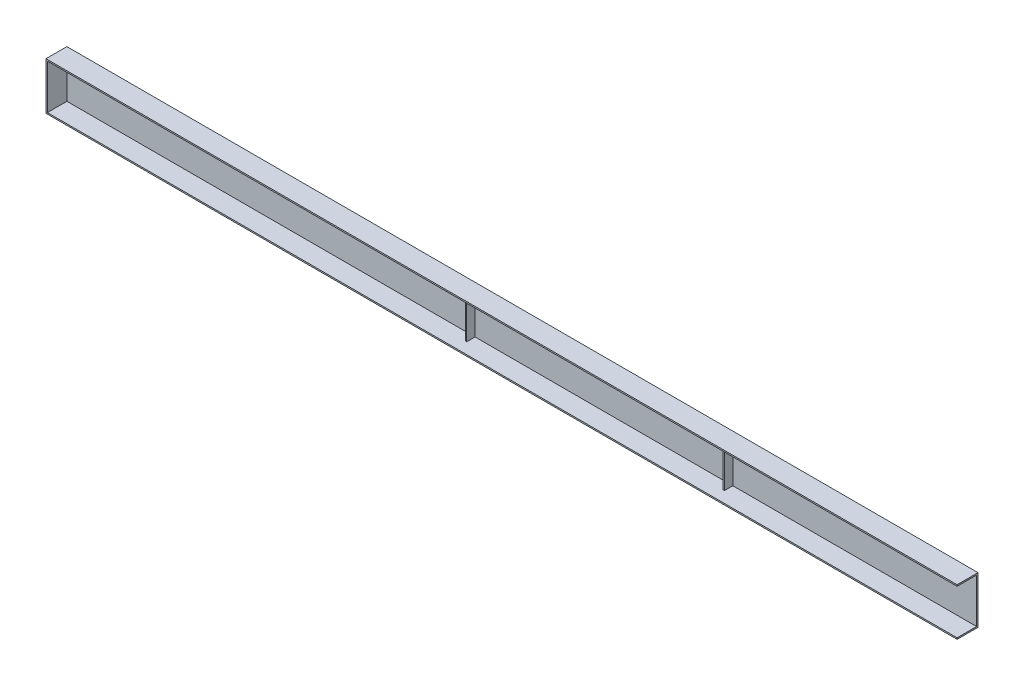
ISO-10303-21;
HEADER;
FILE_DESCRIPTION(('STEP AP214'),'2;1');
FILE_NAME('part.step','',(''),(''),'','','');
FILE_SCHEMA(('AUTOMOTIVE_DESIGN { 1 0 10303 214 1 1 1 1 }'));
ENDSEC;
DATA;
#1=APPLICATION_CONTEXT('core data for automotive mechanical design processes');
#2=APPLICATION_PROTOCOL_DEFINITION('international standard','automotive_design',2000,#1);
#3=PRODUCT_CONTEXT('',#1,'mechanical');
#4=PRODUCT('Part','Part','',(#3));
#5=PRODUCT_RELATED_PRODUCT_CATEGORY('part','',(#4));
#6=PRODUCT_DEFINITION_FORMATION('','',#4);
#7=PRODUCT_DEFINITION_CONTEXT('part definition',#1,'design');
#8=PRODUCT_DEFINITION('design','',#6,#7);
#9=PRODUCT_DEFINITION_SHAPE('','',#8);
#10=(LENGTH_UNIT() NAMED_UNIT(*) SI_UNIT(.MILLI.,.METRE.));
#11=(NAMED_UNIT(*) PLANE_ANGLE_UNIT() SI_UNIT($,.RADIAN.));
#12=(NAMED_UNIT(*) SI_UNIT($,.STERADIAN.) SOLID_ANGLE_UNIT());
#13=UNCERTAINTY_MEASURE_WITH_UNIT(LENGTH_MEASURE(1.E-05),#10,'distance_accuracy_value','');
#14=(GEOMETRIC_REPRESENTATION_CONTEXT(3) GLOBAL_UNCERTAINTY_ASSIGNED_CONTEXT((#13)) GLOBAL_UNIT_ASSIGNED_CONTEXT((#10,
#11,#12)) REPRESENTATION_CONTEXT('',''));
#15=CARTESIAN_POINT('',(0.,0.,0.));
#16=DIRECTION('',(0.,0.,1.));
#17=DIRECTION('',(1.,0.,0.));
#18=AXIS2_PLACEMENT_3D('',#15,#16,#17);
#19=CARTESIAN_POINT('',(-621.,-915.,2038.));
#20=DIRECTION('',(1.,0.,0.));
#21=DIRECTION('',(0.,1.,0.));
#22=AXIS2_PLACEMENT_3D('',#19,#20,#21);
#23=PLANE('',#22);
#24=DIRECTION('',(0.,0.,1.));
#25=VECTOR('',#24,1.);
#26=CARTESIAN_POINT('',(-621.,-847.,2038.));
#27=LINE('',#26,#25);
#28=CARTESIAN_POINT('',(-621.,-847.,2038.));
#29=VERTEX_POINT('',#28);
#30=CARTESIAN_POINT('',(-621.,-847.,2068.));
#31=VERTEX_POINT('',#30);
#32=EDGE_CURVE('E35',#29,#31,#27,.T.);
#33=ORIENTED_EDGE('',*,*,#32,.F.);
#34=DIRECTION('',(0.,1.,0.));
#35=VECTOR('',#34,1.);
#36=CARTESIAN_POINT('',(-621.,-915.,2038.));
#37=LINE('',#36,#35);
#38=CARTESIAN_POINT('',(-621.,-915.,2038.));
#39=VERTEX_POINT('',#38);
#40=EDGE_CURVE('E209',#39,#29,#37,.T.);
#41=ORIENTED_EDGE('',*,*,#40,.F.);
#42=DIRECTION('',(0.,0.,-1.));
#43=VECTOR('',#42,1.);
#44=CARTESIAN_POINT('',(-621.,-915.,2068.));
#45=LINE('',#44,#43);
#46=CARTESIAN_POINT('',(-621.,-915.,2068.));
#47=VERTEX_POINT('',#46);
#48=EDGE_CURVE('E156',#47,#39,#45,.T.);
#49=ORIENTED_EDGE('',*,*,#48,.F.);
#50=DIRECTION('',(0.,1.,0.));
#51=VECTOR('',#50,1.);
#52=CARTESIAN_POINT('',(-621.,-915.,2068.));
#53=LINE('',#52,#51);
#54=EDGE_CURVE('E11',#47,#31,#53,.T.);
#55=ORIENTED_EDGE('',*,*,#54,.T.);
#56=EDGE_LOOP('',(#33,#41,#49,#55));
#57=FACE_BOUND('',#56,.T.);
#58=ADVANCED_FACE('F17',(#57),#23,.F.);
#59=CARTESIAN_POINT('',(-621.,-847.,2068.));
#60=DIRECTION('',(0.,0.,1.));
#61=DIRECTION('',(0.,1.,0.));
#62=AXIS2_PLACEMENT_3D('',#59,#60,#61);
#63=PLANE('',#62);
#64=DIRECTION('',(1.,0.,0.));
#65=VECTOR('',#64,1.);
#66=CARTESIAN_POINT('',(-619.,-849.,2068.));
#67=LINE('',#66,#65);
#68=CARTESIAN_POINT('',(-619.,-849.,2068.));
#69=VERTEX_POINT('',#68);
#70=CARTESIAN_POINT('',(687.,-849.,2068.));
#71=VERTEX_POINT('',#70);
#72=EDGE_CURVE('E27',#69,#71,#67,.T.);
#73=ORIENTED_EDGE('',*,*,#72,.T.);
#74=DIRECTION('',(0.,-1.,0.));
#75=VECTOR('',#74,1.);
#76=CARTESIAN_POINT('',(687.,-847.,2068.));
#77=LINE('',#76,#75);
#78=CARTESIAN_POINT('',(687.,-847.,2068.));
#79=VERTEX_POINT('',#78);
#80=EDGE_CURVE('E106',#79,#71,#77,.T.);
#81=ORIENTED_EDGE('',*,*,#80,.F.);
#82=DIRECTION('',(1.,0.,0.));
#83=VECTOR('',#82,1.);
#84=CARTESIAN_POINT('',(-621.,-847.,2068.));
#85=LINE('',#84,#83);
#86=EDGE_CURVE('E223',#31,#79,#85,.T.);
#87=ORIENTED_EDGE('',*,*,#86,.F.);
#88=ORIENTED_EDGE('',*,*,#54,.F.);
#89=DIRECTION('',(1.,0.,0.));
#90=VECTOR('',#89,1.);
#91=CARTESIAN_POINT('',(-621.,-915.,2068.));
#92=LINE('',#91,#90);
#93=CARTESIAN_POINT('',(687.,-915.,2068.));
#94=VERTEX_POINT('',#93);
#95=EDGE_CURVE('E145',#47,#94,#92,.T.);
#96=ORIENTED_EDGE('',*,*,#95,.T.);
#97=DIRECTION('',(0.,-1.,0.));
#98=VECTOR('',#97,1.);
#99=CARTESIAN_POINT('',(687.,-913.,2068.));
#100=LINE('',#99,#98);
#101=CARTESIAN_POINT('',(687.,-913.,2068.));
#102=VERTEX_POINT('',#101);
#103=EDGE_CURVE('E131',#102,#94,#100,.T.);
#104=ORIENTED_EDGE('',*,*,#103,.F.);
#105=DIRECTION('',(1.,0.,0.));
#106=VECTOR('',#105,1.);
#107=CARTESIAN_POINT('',(-619.,-913.,2068.));
#108=LINE('',#107,#106);
#109=CARTESIAN_POINT('',(-619.,-913.,2068.));
#110=VERTEX_POINT('',#109);
#111=EDGE_CURVE('E200',#110,#102,#108,.T.);
#112=ORIENTED_EDGE('',*,*,#111,.F.);
#113=DIRECTION('',(0.,1.,0.));
#114=VECTOR('',#113,1.);
#115=CARTESIAN_POINT('',(-619.,-913.,2068.));
#116=LINE('',#115,#114);
#117=EDGE_CURVE('E21',#110,#69,#116,.T.);
#118=ORIENTED_EDGE('',*,*,#117,.T.);
#119=EDGE_LOOP('',(#73,#81,#87,#88,#96,#104,#112,#118));
#120=FACE_BOUND('',#119,.T.);
#121=ADVANCED_FACE('F146',(#120),#63,.T.);
#122=CARTESIAN_POINT('',(-619.,-915.,2038.));
#123=DIRECTION('',(-1.,0.,0.));
#124=DIRECTION('',(0.,0.,-1.));
#125=AXIS2_PLACEMENT_3D('',#122,#123,#124);
#126=PLANE('',#125);
#127=DIRECTION('',(0.,0.,-1.));
#128=VECTOR('',#127,1.);
#129=CARTESIAN_POINT('',(-619.,-849.,2068.));
#130=LINE('',#129,#128);
#131=CARTESIAN_POINT('',(-619.,-849.,2040.));
#132=VERTEX_POINT('',#131);
#133=EDGE_CURVE('E171',#69,#132,#130,.T.);
#134=ORIENTED_EDGE('',*,*,#133,.F.);
#135=ORIENTED_EDGE('',*,*,#117,.F.);
#136=DIRECTION('',(0.,0.,1.));
#137=VECTOR('',#136,1.);
#138=CARTESIAN_POINT('',(-619.,-913.,2040.));
#139=LINE('',#138,#137);
#140=CARTESIAN_POINT('',(-619.,-913.,2040.));
#141=VERTEX_POINT('',#140);
#142=EDGE_CURVE('E221',#141,#110,#139,.T.);
#143=ORIENTED_EDGE('',*,*,#142,.F.);
#144=DIRECTION('',(0.,-1.,0.));
#145=VECTOR('',#144,1.);
#146=CARTESIAN_POINT('',(-619.,-849.,2040.));
#147=LINE('',#146,#145);
#148=EDGE_CURVE('E190',#132,#141,#147,.T.);
#149=ORIENTED_EDGE('',*,*,#148,.F.);
#150=EDGE_LOOP('',(#134,#135,#143,#149));
#151=FACE_BOUND('',#150,.T.);
#152=ADVANCED_FACE('F301',(#151),#126,.F.);
#153=CARTESIAN_POINT('',(-621.,-849.,2040.));
#154=DIRECTION('',(0.,0.,1.));
#155=DIRECTION('',(0.,1.,0.));
#156=AXIS2_PLACEMENT_3D('',#153,#154,#155);
#157=PLANE('',#156);
#158=DIRECTION('',(1.,0.,0.));
#159=VECTOR('',#158,1.);
#160=CARTESIAN_POINT('',(337.,-913.,2040.));
#161=LINE('',#160,#159);
#162=CARTESIAN_POINT('',(337.,-913.,2040.));
#163=VERTEX_POINT('',#162);
#164=CARTESIAN_POINT('',(687.,-913.,2040.));
#165=VERTEX_POINT('',#164);
#166=EDGE_CURVE('E163',#163,#165,#161,.T.);
#167=ORIENTED_EDGE('',*,*,#166,.T.);
#168=DIRECTION('',(0.,-1.,0.));
#169=VECTOR('',#168,1.);
#170=CARTESIAN_POINT('',(687.,-849.,2040.));
#171=LINE('',#170,#169);
#172=CARTESIAN_POINT('',(687.,-849.,2040.));
#173=VERTEX_POINT('',#172);
#174=EDGE_CURVE('E175',#173,#165,#171,.T.);
#175=ORIENTED_EDGE('',*,*,#174,.F.);
#176=DIRECTION('',(1.,0.,0.));
#177=VECTOR('',#176,1.);
#178=CARTESIAN_POINT('',(337.,-849.,2040.));
#179=LINE('',#178,#177);
#180=CARTESIAN_POINT('',(337.,-849.,2040.));
#181=VERTEX_POINT('',#180);
#182=EDGE_CURVE('E173',#181,#173,#179,.T.);
#183=ORIENTED_EDGE('',*,*,#182,.F.);
#184=DIRECTION('',(0.,-1.,0.));
#185=VECTOR('',#184,1.);
#186=CARTESIAN_POINT('',(337.,-849.,2040.));
#187=LINE('',#186,#185);
#188=EDGE_CURVE('E161',#181,#163,#187,.T.);
#189=ORIENTED_EDGE('',*,*,#188,.T.);
#190=EDGE_LOOP('',(#167,#175,#183,#189));
#191=FACE_BOUND('',#190,.T.);
#192=ADVANCED_FACE('F304',(#191),#157,.T.);
#193=CARTESIAN_POINT('',(-621.,-849.,2040.));
#194=DIRECTION('',(0.,0.,1.));
#195=DIRECTION('',(0.,1.,0.));
#196=AXIS2_PLACEMENT_3D('',#193,#194,#195);
#197=PLANE('',#196);
#198=DIRECTION('',(1.,0.,0.));
#199=VECTOR('',#198,1.);
#200=CARTESIAN_POINT('',(-33.,-913.,2040.));
#201=LINE('',#200,#199);
#202=CARTESIAN_POINT('',(-33.,-913.,2040.));
#203=VERTEX_POINT('',#202);
#204=CARTESIAN_POINT('',(335.,-913.,2040.));
#205=VERTEX_POINT('',#204);
#206=EDGE_CURVE('E164',#203,#205,#201,.T.);
#207=ORIENTED_EDGE('',*,*,#206,.T.);
#208=DIRECTION('',(0.,-1.,0.));
#209=VECTOR('',#208,1.);
#210=CARTESIAN_POINT('',(335.,-849.,2040.));
#211=LINE('',#210,#209);
#212=CARTESIAN_POINT('',(335.,-849.,2040.));
#213=VERTEX_POINT('',#212);
#214=EDGE_CURVE('E168',#213,#205,#211,.T.);
#215=ORIENTED_EDGE('',*,*,#214,.F.);
#216=DIRECTION('',(1.,0.,0.));
#217=VECTOR('',#216,1.);
#218=CARTESIAN_POINT('',(-33.,-849.,2040.));
#219=LINE('',#218,#217);
#220=CARTESIAN_POINT('',(-33.,-849.,2040.));
#221=VERTEX_POINT('',#220);
#222=EDGE_CURVE('E181',#221,#213,#219,.T.);
#223=ORIENTED_EDGE('',*,*,#222,.F.);
#224=DIRECTION('',(0.,-1.,0.));
#225=VECTOR('',#224,1.);
#226=CARTESIAN_POINT('',(-33.,-849.,2040.));
#227=LINE('',#226,#225);
#228=EDGE_CURVE('E189',#221,#203,#227,.T.);
#229=ORIENTED_EDGE('',*,*,#228,.T.);
#230=EDGE_LOOP('',(#207,#215,#223,#229));
#231=FACE_BOUND('',#230,.T.);
#232=ADVANCED_FACE('F274',(#231),#197,.T.);
#233=CARTESIAN_POINT('',(-621.,-849.,2040.));
#234=DIRECTION('',(0.,0.,1.));
#235=DIRECTION('',(0.,1.,0.));
#236=AXIS2_PLACEMENT_3D('',#233,#234,#235);
#237=PLANE('',#236);
#238=DIRECTION('',(1.,0.,0.));
#239=VECTOR('',#238,1.);
#240=CARTESIAN_POINT('',(-619.,-913.,2040.));
#241=LINE('',#240,#239);
#242=CARTESIAN_POINT('',(-35.,-913.,2040.));
#243=VERTEX_POINT('',#242);
#244=EDGE_CURVE('E186',#141,#243,#241,.T.);
#245=ORIENTED_EDGE('',*,*,#244,.T.);
#246=DIRECTION('',(0.,-1.,0.));
#247=VECTOR('',#246,1.);
#248=CARTESIAN_POINT('',(-35.,-849.,2040.));
#249=LINE('',#248,#247);
#250=CARTESIAN_POINT('',(-35.,-849.,2040.));
#251=VERTEX_POINT('',#250);
#252=EDGE_CURVE('E191',#251,#243,#249,.T.);
#253=ORIENTED_EDGE('',*,*,#252,.F.);
#254=DIRECTION('',(1.,0.,0.));
#255=VECTOR('',#254,1.);
#256=CARTESIAN_POINT('',(-619.,-849.,2040.));
#257=LINE('',#256,#255);
#258=EDGE_CURVE('E194',#132,#251,#257,.T.);
#259=ORIENTED_EDGE('',*,*,#258,.F.);
#260=ORIENTED_EDGE('',*,*,#148,.T.);
#261=EDGE_LOOP('',(#245,#253,#259,#260));
#262=FACE_BOUND('',#261,.T.);
#263=ADVANCED_FACE('F297',(#262),#237,.T.);
#264=CARTESIAN_POINT('',(337.,-913.,2040.));
#265=DIRECTION('',(1.,0.,0.));
#266=DIRECTION('',(0.,1.,0.));
#267=AXIS2_PLACEMENT_3D('',#264,#265,#266);
#268=PLANE('',#267);
#269=DIRECTION('',(0.,0.,1.));
#270=VECTOR('',#269,1.);
#271=CARTESIAN_POINT('',(337.,-849.,2040.));
#272=LINE('',#271,#270);
#273=CARTESIAN_POINT('',(337.,-849.,2052.));
#274=VERTEX_POINT('',#273);
#275=EDGE_CURVE('E197',#181,#274,#272,.T.);
#276=ORIENTED_EDGE('',*,*,#275,.T.);
#277=DIRECTION('',(0.,1.,0.));
#278=VECTOR('',#277,1.);
#279=CARTESIAN_POINT('',(337.,-913.,2052.));
#280=LINE('',#279,#278);
#281=CARTESIAN_POINT('',(337.,-913.,2052.));
#282=VERTEX_POINT('',#281);
#283=EDGE_CURVE('E178',#282,#274,#280,.T.);
#284=ORIENTED_EDGE('',*,*,#283,.F.);
#285=DIRECTION('',(0.,0.,1.));
#286=VECTOR('',#285,1.);
#287=CARTESIAN_POINT('',(337.,-913.,2040.));
#288=LINE('',#287,#286);
#289=EDGE_CURVE('E243',#163,#282,#288,.T.);
#290=ORIENTED_EDGE('',*,*,#289,.F.);
#291=ORIENTED_EDGE('',*,*,#188,.F.);
#292=EDGE_LOOP('',(#276,#284,#290,#291));
#293=FACE_BOUND('',#292,.T.);
#294=ADVANCED_FACE('F266',(#293),#268,.T.);
#295=CARTESIAN_POINT('',(-621.,-913.,2040.));
#296=DIRECTION('',(0.,1.,0.));
#297=DIRECTION('',(0.,0.,1.));
#298=AXIS2_PLACEMENT_3D('',#295,#296,#297);
#299=PLANE('',#298);
#300=ORIENTED_EDGE('',*,*,#111,.T.);
#301=DIRECTION('',(0.,0.,1.));
#302=VECTOR('',#301,1.);
#303=CARTESIAN_POINT('',(687.,-913.,2040.));
#304=LINE('',#303,#302);
#305=EDGE_CURVE('E139',#165,#102,#304,.T.);
#306=ORIENTED_EDGE('',*,*,#305,.F.);
#307=ORIENTED_EDGE('',*,*,#166,.F.);
#308=ORIENTED_EDGE('',*,*,#289,.T.);
#309=DIRECTION('',(1.,0.,0.));
#310=VECTOR('',#309,1.);
#311=CARTESIAN_POINT('',(335.,-913.,2052.));
#312=LINE('',#311,#310);
#313=CARTESIAN_POINT('',(335.,-913.,2052.));
#314=VERTEX_POINT('',#313);
#315=EDGE_CURVE('E167',#314,#282,#312,.T.);
#316=ORIENTED_EDGE('',*,*,#315,.F.);
#317=DIRECTION('',(0.,0.,1.));
#318=VECTOR('',#317,1.);
#319=CARTESIAN_POINT('',(335.,-913.,2040.));
#320=LINE('',#319,#318);
#321=EDGE_CURVE('E165',#205,#314,#320,.T.);
#322=ORIENTED_EDGE('',*,*,#321,.F.);
#323=ORIENTED_EDGE('',*,*,#206,.F.);
#324=DIRECTION('',(0.,0.,1.));
#325=VECTOR('',#324,1.);
#326=CARTESIAN_POINT('',(-33.,-913.,2040.));
#327=LINE('',#326,#325);
#328=CARTESIAN_POINT('',(-33.,-913.,2052.));
#329=VERTEX_POINT('',#328);
#330=EDGE_CURVE('E160',#203,#329,#327,.T.);
#331=ORIENTED_EDGE('',*,*,#330,.T.);
#332=DIRECTION('',(1.,0.,0.));
#333=VECTOR('',#332,1.);
#334=CARTESIAN_POINT('',(-35.,-913.,2052.));
#335=LINE('',#334,#333);
#336=CARTESIAN_POINT('',(-35.,-913.,2052.));
#337=VERTEX_POINT('',#336);
#338=EDGE_CURVE('E229',#337,#329,#335,.T.);
#339=ORIENTED_EDGE('',*,*,#338,.F.);
#340=DIRECTION('',(0.,0.,1.));
#341=VECTOR('',#340,1.);
#342=CARTESIAN_POINT('',(-35.,-913.,2040.));
#343=LINE('',#342,#341);
#344=EDGE_CURVE('E193',#243,#337,#343,.T.);
#345=ORIENTED_EDGE('',*,*,#344,.F.);
#346=ORIENTED_EDGE('',*,*,#244,.F.);
#347=ORIENTED_EDGE('',*,*,#142,.T.);
#348=EDGE_LOOP('',(#300,#306,#307,#308,#316,#322,#323,#331,#339,#345,#346,#347));
#349=FACE_BOUND('',#348,.T.);
#350=ADVANCED_FACE('F260',(#349),#299,.T.);
#351=CARTESIAN_POINT('',(-35.,-849.,2040.));
#352=DIRECTION('',(-1.,0.,0.));
#353=DIRECTION('',(0.,0.,-1.));
#354=AXIS2_PLACEMENT_3D('',#351,#352,#353);
#355=PLANE('',#354);
#356=ORIENTED_EDGE('',*,*,#344,.T.);
#357=DIRECTION('',(0.,-1.,0.));
#358=VECTOR('',#357,1.);
#359=CARTESIAN_POINT('',(-35.,-849.,2052.));
#360=LINE('',#359,#358);
#361=CARTESIAN_POINT('',(-35.,-849.,2052.));
#362=VERTEX_POINT('',#361);
#363=EDGE_CURVE('E213',#362,#337,#360,.T.);
#364=ORIENTED_EDGE('',*,*,#363,.F.);
#365=DIRECTION('',(0.,0.,1.));
#366=VECTOR('',#365,1.);
#367=CARTESIAN_POINT('',(-35.,-849.,2040.));
#368=LINE('',#367,#366);
#369=EDGE_CURVE('E218',#251,#362,#368,.T.);
#370=ORIENTED_EDGE('',*,*,#369,.F.);
#371=ORIENTED_EDGE('',*,*,#252,.T.);
#372=EDGE_LOOP('',(#356,#364,#370,#371));
#373=FACE_BOUND('',#372,.T.);
#374=ADVANCED_FACE('F290',(#373),#355,.T.);
#375=CARTESIAN_POINT('',(-621.,-849.,2068.));
#376=DIRECTION('',(0.,-1.,0.));
#377=DIRECTION('',(1.,0.,0.));
#378=AXIS2_PLACEMENT_3D('',#375,#376,#377);
#379=PLANE('',#378);
#380=ORIENTED_EDGE('',*,*,#258,.T.);
#381=ORIENTED_EDGE('',*,*,#369,.T.);
#382=DIRECTION('',(1.,0.,0.));
#383=VECTOR('',#382,1.);
#384=CARTESIAN_POINT('',(-35.,-849.,2052.));
#385=LINE('',#384,#383);
#386=CARTESIAN_POINT('',(-33.,-849.,2052.));
#387=VERTEX_POINT('',#386);
#388=EDGE_CURVE('E184',#362,#387,#385,.T.);
#389=ORIENTED_EDGE('',*,*,#388,.T.);
#390=DIRECTION('',(0.,0.,1.));
#391=VECTOR('',#390,1.);
#392=CARTESIAN_POINT('',(-33.,-849.,2040.));
#393=LINE('',#392,#391);
#394=EDGE_CURVE('E170',#221,#387,#393,.T.);
#395=ORIENTED_EDGE('',*,*,#394,.F.);
#396=ORIENTED_EDGE('',*,*,#222,.T.);
#397=DIRECTION('',(0.,0.,1.));
#398=VECTOR('',#397,1.);
#399=CARTESIAN_POINT('',(335.,-849.,2040.));
#400=LINE('',#399,#398);
#401=CARTESIAN_POINT('',(335.,-849.,2052.));
#402=VERTEX_POINT('',#401);
#403=EDGE_CURVE('E185',#213,#402,#400,.T.);
#404=ORIENTED_EDGE('',*,*,#403,.T.);
#405=DIRECTION('',(1.,0.,0.));
#406=VECTOR('',#405,1.);
#407=CARTESIAN_POINT('',(335.,-849.,2052.));
#408=LINE('',#407,#406);
#409=EDGE_CURVE('E205',#402,#274,#408,.T.);
#410=ORIENTED_EDGE('',*,*,#409,.T.);
#411=ORIENTED_EDGE('',*,*,#275,.F.);
#412=ORIENTED_EDGE('',*,*,#182,.T.);
#413=DIRECTION('',(0.,0.,-1.));
#414=VECTOR('',#413,1.);
#415=CARTESIAN_POINT('',(687.,-849.,2068.));
#416=LINE('',#415,#414);
#417=EDGE_CURVE('E177',#71,#173,#416,.T.);
#418=ORIENTED_EDGE('',*,*,#417,.F.);
#419=ORIENTED_EDGE('',*,*,#72,.F.);
#420=ORIENTED_EDGE('',*,*,#133,.T.);
#421=EDGE_LOOP('',(#380,#381,#389,#395,#396,#404,#410,#411,#412,#418,#419,#420));
#422=FACE_BOUND('',#421,.T.);
#423=ADVANCED_FACE('F269',(#422),#379,.T.);
#424=CARTESIAN_POINT('',(687.,-915.,2038.));
#425=DIRECTION('',(1.,0.,0.));
#426=DIRECTION('',(0.,1.,0.));
#427=AXIS2_PLACEMENT_3D('',#424,#425,#426);
#428=PLANE('',#427);
#429=DIRECTION('',(0.,1.,0.));
#430=VECTOR('',#429,1.);
#431=CARTESIAN_POINT('',(687.,-915.,2038.));
#432=LINE('',#431,#430);
#433=CARTESIAN_POINT('',(687.,-915.,2038.));
#434=VERTEX_POINT('',#433);
#435=CARTESIAN_POINT('',(687.,-847.,2038.));
#436=VERTEX_POINT('',#435);
#437=EDGE_CURVE('E174',#434,#436,#432,.T.);
#438=ORIENTED_EDGE('',*,*,#437,.T.);
#439=DIRECTION('',(0.,0.,1.));
#440=VECTOR('',#439,1.);
#441=CARTESIAN_POINT('',(687.,-847.,2038.));
#442=LINE('',#441,#440);
#443=EDGE_CURVE('E232',#436,#79,#442,.T.);
#444=ORIENTED_EDGE('',*,*,#443,.T.);
#445=ORIENTED_EDGE('',*,*,#80,.T.);
#446=ORIENTED_EDGE('',*,*,#417,.T.);
#447=ORIENTED_EDGE('',*,*,#174,.T.);
#448=ORIENTED_EDGE('',*,*,#305,.T.);
#449=ORIENTED_EDGE('',*,*,#103,.T.);
#450=DIRECTION('',(0.,0.,-1.));
#451=VECTOR('',#450,1.);
#452=CARTESIAN_POINT('',(687.,-915.,2068.));
#453=LINE('',#452,#451);
#454=EDGE_CURVE('E136',#94,#434,#453,.T.);
#455=ORIENTED_EDGE('',*,*,#454,.T.);
#456=EDGE_LOOP('',(#438,#444,#445,#446,#447,#448,#449,#455));
#457=FACE_BOUND('',#456,.T.);
#458=ADVANCED_FACE('F134',(#457),#428,.T.);
#459=CARTESIAN_POINT('',(-621.,-915.,2068.));
#460=DIRECTION('',(0.,-1.,0.));
#461=DIRECTION('',(1.,0.,0.));
#462=AXIS2_PLACEMENT_3D('',#459,#460,#461);
#463=PLANE('',#462);
#464=DIRECTION('',(1.,0.,0.));
#465=VECTOR('',#464,1.);
#466=CARTESIAN_POINT('',(-621.,-915.,2038.));
#467=LINE('',#466,#465);
#468=EDGE_CURVE('E154',#39,#434,#467,.T.);
#469=ORIENTED_EDGE('',*,*,#468,.T.);
#470=ORIENTED_EDGE('',*,*,#454,.F.);
#471=ORIENTED_EDGE('',*,*,#95,.F.);
#472=ORIENTED_EDGE('',*,*,#48,.T.);
#473=EDGE_LOOP('',(#469,#470,#471,#472));
#474=FACE_BOUND('',#473,.T.);
#475=ADVANCED_FACE('F152',(#474),#463,.T.);
#476=CARTESIAN_POINT('',(-621.,-915.,2038.));
#477=DIRECTION('',(0.,0.,-1.));
#478=DIRECTION('',(-1.,0.,0.));
#479=AXIS2_PLACEMENT_3D('',#476,#477,#478);
#480=PLANE('',#479);
#481=DIRECTION('',(1.,0.,0.));
#482=VECTOR('',#481,1.);
#483=CARTESIAN_POINT('',(-621.,-847.,2038.));
#484=LINE('',#483,#482);
#485=EDGE_CURVE('E206',#29,#436,#484,.T.);
#486=ORIENTED_EDGE('',*,*,#485,.T.);
#487=ORIENTED_EDGE('',*,*,#437,.F.);
#488=ORIENTED_EDGE('',*,*,#468,.F.);
#489=ORIENTED_EDGE('',*,*,#40,.T.);
#490=EDGE_LOOP('',(#486,#487,#488,#489));
#491=FACE_BOUND('',#490,.T.);
#492=ADVANCED_FACE('F327',(#491),#480,.T.);
#493=CARTESIAN_POINT('',(-621.,-847.,2038.));
#494=DIRECTION('',(0.,1.,0.));
#495=DIRECTION('',(0.,0.,1.));
#496=AXIS2_PLACEMENT_3D('',#493,#494,#495);
#497=PLANE('',#496);
#498=ORIENTED_EDGE('',*,*,#86,.T.);
#499=ORIENTED_EDGE('',*,*,#443,.F.);
#500=ORIENTED_EDGE('',*,*,#485,.F.);
#501=ORIENTED_EDGE('',*,*,#32,.T.);
#502=EDGE_LOOP('',(#498,#499,#500,#501));
#503=FACE_BOUND('',#502,.T.);
#504=ADVANCED_FACE('F329',(#503),#497,.T.);
#505=CARTESIAN_POINT('',(-621.,-915.,2052.));
#506=DIRECTION('',(0.,0.,1.));
#507=DIRECTION('',(0.,1.,0.));
#508=AXIS2_PLACEMENT_3D('',#505,#506,#507);
#509=PLANE('',#508);
#510=ORIENTED_EDGE('',*,*,#283,.T.);
#511=ORIENTED_EDGE('',*,*,#409,.F.);
#512=DIRECTION('',(0.,-1.,0.));
#513=VECTOR('',#512,1.);
#514=CARTESIAN_POINT('',(335.,-849.,2052.));
#515=LINE('',#514,#513);
#516=EDGE_CURVE('E180',#402,#314,#515,.T.);
#517=ORIENTED_EDGE('',*,*,#516,.T.);
#518=ORIENTED_EDGE('',*,*,#315,.T.);
#519=EDGE_LOOP('',(#510,#511,#517,#518));
#520=FACE_BOUND('',#519,.T.);
#521=ADVANCED_FACE('F19',(#520),#509,.T.);
#522=CARTESIAN_POINT('',(335.,-849.,2040.));
#523=DIRECTION('',(-1.,0.,0.));
#524=DIRECTION('',(0.,0.,-1.));
#525=AXIS2_PLACEMENT_3D('',#522,#523,#524);
#526=PLANE('',#525);
#527=ORIENTED_EDGE('',*,*,#321,.T.);
#528=ORIENTED_EDGE('',*,*,#516,.F.);
#529=ORIENTED_EDGE('',*,*,#403,.F.);
#530=ORIENTED_EDGE('',*,*,#214,.T.);
#531=EDGE_LOOP('',(#527,#528,#529,#530));
#532=FACE_BOUND('',#531,.T.);
#533=ADVANCED_FACE('F255',(#532),#526,.T.);
#534=CARTESIAN_POINT('',(-33.,-913.,2040.));
#535=DIRECTION('',(1.,0.,0.));
#536=DIRECTION('',(0.,1.,0.));
#537=AXIS2_PLACEMENT_3D('',#534,#535,#536);
#538=PLANE('',#537);
#539=ORIENTED_EDGE('',*,*,#394,.T.);
#540=DIRECTION('',(0.,1.,0.));
#541=VECTOR('',#540,1.);
#542=CARTESIAN_POINT('',(-33.,-913.,2052.));
#543=LINE('',#542,#541);
#544=EDGE_CURVE('E210',#329,#387,#543,.T.);
#545=ORIENTED_EDGE('',*,*,#544,.F.);
#546=ORIENTED_EDGE('',*,*,#330,.F.);
#547=ORIENTED_EDGE('',*,*,#228,.F.);
#548=EDGE_LOOP('',(#539,#545,#546,#547));
#549=FACE_BOUND('',#548,.T.);
#550=ADVANCED_FACE('F277',(#549),#538,.T.);
#551=CARTESIAN_POINT('',(-621.,-915.,2052.));
#552=DIRECTION('',(0.,0.,1.));
#553=DIRECTION('',(0.,1.,0.));
#554=AXIS2_PLACEMENT_3D('',#551,#552,#553);
#555=PLANE('',#554);
#556=ORIENTED_EDGE('',*,*,#544,.T.);
#557=ORIENTED_EDGE('',*,*,#388,.F.);
#558=ORIENTED_EDGE('',*,*,#363,.T.);
#559=ORIENTED_EDGE('',*,*,#338,.T.);
#560=EDGE_LOOP('',(#556,#557,#558,#559));
#561=FACE_BOUND('',#560,.T.);
#562=ADVANCED_FACE('F286',(#561),#555,.T.);
#563=CLOSED_SHELL('',(#58,#121,#152,#192,#232,#263,#294,#350,#374,#423,#458,#475,#492,#504,#521,
#533,#550,#562));
#564=MANIFOLD_SOLID_BREP('B1',#563);
#565=ADVANCED_BREP_SHAPE_REPRESENTATION('',(#18,#564),#14);
#566=SHAPE_DEFINITION_REPRESENTATION(#9,#565);
ENDSEC;
END-ISO-10303-21;
